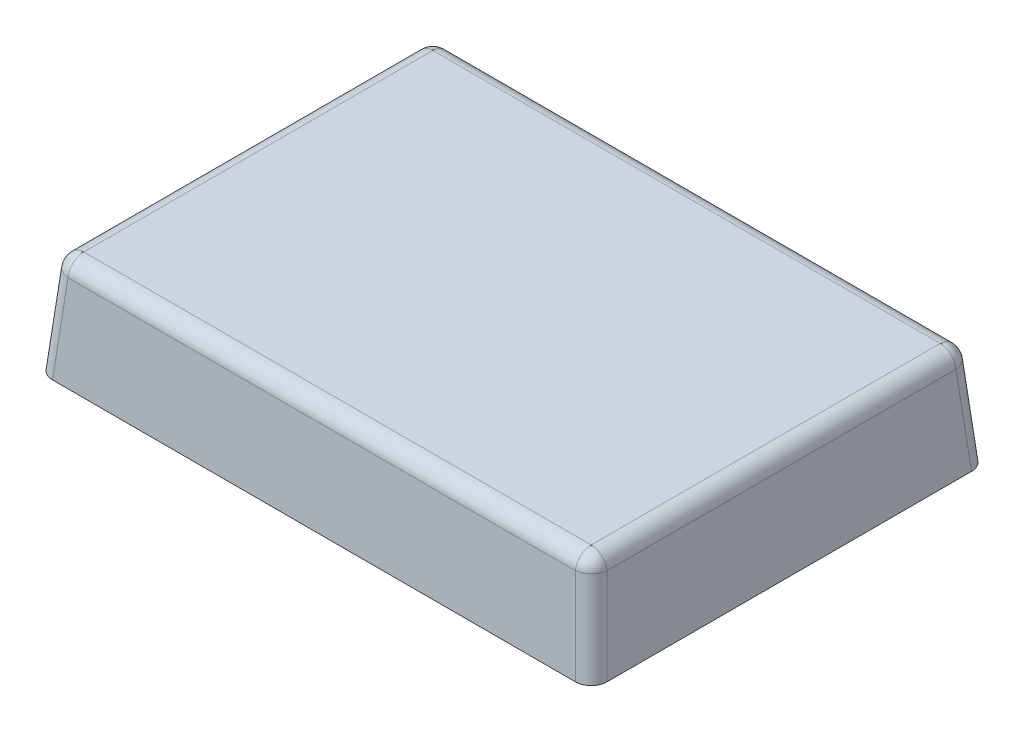
ISO-10303-21;
HEADER;
FILE_DESCRIPTION(('STEP AP214'),'2;1');
FILE_NAME('part.step','',(''),(''),'','','');
FILE_SCHEMA(('AUTOMOTIVE_DESIGN { 1 0 10303 214 1 1 1 1 }'));
ENDSEC;
DATA;
#1=APPLICATION_CONTEXT('core data for automotive mechanical design processes');
#2=APPLICATION_PROTOCOL_DEFINITION('international standard','automotive_design',2000,#1);
#3=PRODUCT_CONTEXT('',#1,'mechanical');
#4=PRODUCT('Part','Part','',(#3));
#5=PRODUCT_RELATED_PRODUCT_CATEGORY('part','',(#4));
#6=PRODUCT_DEFINITION_FORMATION('','',#4);
#7=PRODUCT_DEFINITION_CONTEXT('part definition',#1,'design');
#8=PRODUCT_DEFINITION('design','',#6,#7);
#9=PRODUCT_DEFINITION_SHAPE('','',#8);
#10=(LENGTH_UNIT() NAMED_UNIT(*) SI_UNIT(.MILLI.,.METRE.));
#11=(NAMED_UNIT(*) PLANE_ANGLE_UNIT() SI_UNIT($,.RADIAN.));
#12=(NAMED_UNIT(*) SI_UNIT($,.STERADIAN.) SOLID_ANGLE_UNIT());
#13=UNCERTAINTY_MEASURE_WITH_UNIT(LENGTH_MEASURE(1.E-05),#10,'distance_accuracy_value','');
#14=(GEOMETRIC_REPRESENTATION_CONTEXT(3) GLOBAL_UNCERTAINTY_ASSIGNED_CONTEXT((#13)) GLOBAL_UNIT_ASSIGNED_CONTEXT((#10,
#11,#12)) REPRESENTATION_CONTEXT('',''));
#15=CARTESIAN_POINT('',(0.,0.,0.));
#16=DIRECTION('',(0.,0.,1.));
#17=DIRECTION('',(1.,0.,0.));
#18=AXIS2_PLACEMENT_3D('',#15,#16,#17);
#19=CARTESIAN_POINT('',(0.,0.185,-0.220299850261));
#20=DIRECTION('',(-1.,0.,0.));
#21=DIRECTION('',(0.,0.,1.));
#22=AXIS2_PLACEMENT_3D('',#19,#20,#21);
#23=CYLINDRICAL_SURFACE('',#22,0.02);
#24=CARTESIAN_POINT('',(0.320299850261,0.185,-0.220299850261));
#25=DIRECTION('',(-1.,0.,0.));
#26=DIRECTION('',(0.,1.,0.));
#27=AXIS2_PLACEMENT_3D('',#24,#25,#26);
#28=CIRCLE('',#27,0.02);
#29=CARTESIAN_POINT('',(0.320299850261,0.205,-0.220299850261));
#30=VERTEX_POINT('',#29);
#31=CARTESIAN_POINT('',(0.320299850261,0.186743114855,-0.240223744223));
#32=VERTEX_POINT('',#31);
#33=EDGE_CURVE('E27',#30,#32,#28,.T.);
#34=ORIENTED_EDGE('',*,*,#33,.T.);
#35=DIRECTION('',(1.,0.,0.));
#36=VECTOR('',#35,1.);
#37=CARTESIAN_POINT('',(0.338626473742,0.186743114855,-0.240223744223));
#38=LINE('',#37,#36);
#39=CARTESIAN_POINT('',(-0.320299850261,0.186743114855,-0.240223744223));
#40=VERTEX_POINT('',#39);
#41=EDGE_CURVE('E106',#40,#32,#38,.T.);
#42=ORIENTED_EDGE('',*,*,#41,.F.);
#43=CARTESIAN_POINT('',(-0.320299850261,0.185,-0.220299850261));
#44=DIRECTION('',(1.,0.,0.));
#45=DIRECTION('',(0.,0.,1.));
#46=AXIS2_PLACEMENT_3D('',#43,#44,#45);
#47=CIRCLE('',#46,0.02);
#48=CARTESIAN_POINT('',(-0.320299850261,0.205,-0.220299850261));
#49=VERTEX_POINT('',#48);
#50=EDGE_CURVE('E11',#40,#49,#47,.T.);
#51=ORIENTED_EDGE('',*,*,#50,.T.);
#52=DIRECTION('',(-1.,0.,0.));
#53=VECTOR('',#52,1.);
#54=CARTESIAN_POINT('',(-0.338626473742,0.205,-0.220299850261));
#55=LINE('',#54,#53);
#56=EDGE_CURVE('E86',#30,#49,#55,.T.);
#57=ORIENTED_EDGE('',*,*,#56,.F.);
#58=EDGE_LOOP('',(#34,#42,#51,#57));
#59=FACE_BOUND('',#58,.T.);
#60=ADVANCED_FACE('F17',(#59),#23,.T.);
#61=CARTESIAN_POINT('',(-0.320299850261,0.185,-0.220299850261));
#62=DIRECTION('',(0.,1.,0.));
#63=DIRECTION('',(1.,0.,0.));
#64=AXIS2_PLACEMENT_3D('',#61,#62,#63);
#65=SPHERICAL_SURFACE('',#64,0.02);
#66=CARTESIAN_POINT('',(-0.320299850261,0.185,-0.220299850261));
#67=DIRECTION('',(0.086826593864247,0.992432509138967,0.0868265938642471));
#68=DIRECTION('',(-0.996194698091746,0.0871557427476575,0.));
#69=AXIS2_PLACEMENT_3D('',#66,#67,#68);
#70=CIRCLE('',#69,0.02);
#71=CARTESIAN_POINT('',(-0.340223744223,0.186743114855,-0.220299850261));
#72=VERTEX_POINT('',#71);
#73=EDGE_CURVE('E71',#40,#72,#70,.T.);
#74=ORIENTED_EDGE('',*,*,#73,.T.);
#75=CARTESIAN_POINT('',(-0.320299850261,0.185,-0.220299850261));
#76=DIRECTION('',(0.,0.,-1.));
#77=DIRECTION('',(0.,1.,0.));
#78=AXIS2_PLACEMENT_3D('',#75,#76,#77);
#79=CIRCLE('',#78,0.02);
#80=EDGE_CURVE('E83',#72,#49,#79,.T.);
#81=ORIENTED_EDGE('',*,*,#80,.T.);
#82=ORIENTED_EDGE('',*,*,#50,.F.);
#83=EDGE_LOOP('',(#74,#81,#82));
#84=FACE_BOUND('',#83,.T.);
#85=ADVANCED_FACE('F19',(#84),#65,.T.);
#86=CARTESIAN_POINT('',(0.320299850261,0.185,-0.220299850261));
#87=DIRECTION('',(0.,1.,0.));
#88=DIRECTION('',(1.,0.,0.));
#89=AXIS2_PLACEMENT_3D('',#86,#87,#88);
#90=SPHERICAL_SURFACE('',#89,0.02);
#91=CARTESIAN_POINT('',(0.320299850261,0.185,-0.220299850261));
#92=DIRECTION('',(0.,0.,-1.));
#93=DIRECTION('',(-1.,0.,0.));
#94=AXIS2_PLACEMENT_3D('',#91,#92,#93);
#95=CIRCLE('',#94,0.02);
#96=CARTESIAN_POINT('',(0.340223744223,0.186743114855,-0.220299850261));
#97=VERTEX_POINT('',#96);
#98=EDGE_CURVE('E63',#30,#97,#95,.T.);
#99=ORIENTED_EDGE('',*,*,#98,.T.);
#100=CARTESIAN_POINT('',(0.320299850261,0.185,-0.220299850261));
#101=DIRECTION('',(-0.0868265938642471,0.992432509138967,0.086826593864247));
#102=DIRECTION('',(0.,-0.0871557427476575,0.996194698091746));
#103=AXIS2_PLACEMENT_3D('',#100,#101,#102);
#104=CIRCLE('',#103,0.02);
#105=EDGE_CURVE('E65',#97,#32,#104,.T.);
#106=ORIENTED_EDGE('',*,*,#105,.T.);
#107=ORIENTED_EDGE('',*,*,#33,.F.);
#108=EDGE_LOOP('',(#99,#106,#107));
#109=FACE_BOUND('',#108,.T.);
#110=ADVANCED_FACE('F61',(#109),#90,.T.);
#111=CARTESIAN_POINT('',(-0.326456880733,0.114624819683,-0.226456880733));
#112=DIRECTION('',(-0.086826593864247,-0.992432509138967,-0.0868265938642471));
#113=DIRECTION('',(0.996194698091746,-0.0871557427476575,0.));
#114=AXIS2_PLACEMENT_3D('',#111,#112,#113);
#115=CYLINDRICAL_SURFACE('',#114,0.02);
#116=CARTESIAN_POINT('',(-0.329923603249521,0.075,-0.229923603249521));
#117=DIRECTION('',(0.,-1.,0.));
#118=DIRECTION('',(0.70710678118655,0.,0.707106781186545));
#119=AXIS2_PLACEMENT_3D('',#116,#117,#118);
#120=ELLIPSE('',#119,0.020152503889007,0.02);
#121=CARTESIAN_POINT('',(-0.35,0.075,-0.230076106038));
#122=VERTEX_POINT('',#121);
#123=CARTESIAN_POINT('',(-0.330076106038,0.075,-0.25));
#124=VERTEX_POINT('',#123);
#125=EDGE_CURVE('E112',#122,#124,#120,.T.);
#126=ORIENTED_EDGE('',*,*,#125,.F.);
#127=DIRECTION('',(-0.0868265938642471,-0.992432509138967,-0.0868265938642471));
#128=VECTOR('',#127,1.);
#129=CARTESIAN_POINT('',(-0.346380774694,0.116367934538,-0.226456880733));
#130=LINE('',#129,#128);
#131=EDGE_CURVE('E203',#72,#122,#130,.T.);
#132=ORIENTED_EDGE('',*,*,#131,.F.);
#133=ORIENTED_EDGE('',*,*,#73,.F.);
#134=DIRECTION('',(0.0868265938642471,0.992432509138967,0.0868265938642471));
#135=VECTOR('',#134,1.);
#136=CARTESIAN_POINT('',(-0.324949109252,0.13360184142,-0.244873003214));
#137=LINE('',#136,#135);
#138=EDGE_CURVE('E186',#124,#40,#137,.T.);
#139=ORIENTED_EDGE('',*,*,#138,.F.);
#140=EDGE_LOOP('',(#126,#132,#133,#139));
#141=FACE_BOUND('',#140,.T.);
#142=ADVANCED_FACE('F294',(#141),#115,.T.);
#143=CARTESIAN_POINT('',(-0.320299850261,0.185,0.));
#144=DIRECTION('',(0.,0.,1.));
#145=DIRECTION('',(1.,0.,0.));
#146=AXIS2_PLACEMENT_3D('',#143,#144,#145);
#147=CYLINDRICAL_SURFACE('',#146,0.02);
#148=CARTESIAN_POINT('',(-0.320299850261,0.185,0.220299850261));
#149=DIRECTION('',(0.,0.,-1.));
#150=DIRECTION('',(1.,0.,0.));
#151=AXIS2_PLACEMENT_3D('',#148,#149,#150);
#152=CIRCLE('',#151,0.02);
#153=CARTESIAN_POINT('',(-0.340223744223,0.186743114855,0.220299850261));
#154=VERTEX_POINT('',#153);
#155=CARTESIAN_POINT('',(-0.320299850261,0.205,0.220299850261));
#156=VERTEX_POINT('',#155);
#157=EDGE_CURVE('E39',#154,#156,#152,.T.);
#158=ORIENTED_EDGE('',*,*,#157,.T.);
#159=DIRECTION('',(0.,0.,1.));
#160=VECTOR('',#159,1.);
#161=CARTESIAN_POINT('',(-0.320299850261,0.205,0.238626473742));
#162=LINE('',#161,#160);
#163=EDGE_CURVE('E92',#49,#156,#162,.T.);
#164=ORIENTED_EDGE('',*,*,#163,.F.);
#165=ORIENTED_EDGE('',*,*,#80,.F.);
#166=DIRECTION('',(0.,0.,-1.));
#167=VECTOR('',#166,1.);
#168=CARTESIAN_POINT('',(-0.340223744223,0.186743114855,-0.238626473742));
#169=LINE('',#168,#167);
#170=EDGE_CURVE('E212',#154,#72,#169,.T.);
#171=ORIENTED_EDGE('',*,*,#170,.F.);
#172=EDGE_LOOP('',(#158,#164,#165,#171));
#173=FACE_BOUND('',#172,.T.);
#174=ADVANCED_FACE('F291',(#173),#147,.T.);
#175=CARTESIAN_POINT('',(0.320299850261,0.185,0.));
#176=DIRECTION('',(0.,0.,-1.));
#177=DIRECTION('',(-1.,0.,0.));
#178=AXIS2_PLACEMENT_3D('',#175,#176,#177);
#179=CYLINDRICAL_SURFACE('',#178,0.02);
#180=CARTESIAN_POINT('',(0.320299850261,0.185,0.220299850261));
#181=DIRECTION('',(0.,0.,-1.));
#182=DIRECTION('',(1.,0.,0.));
#183=AXIS2_PLACEMENT_3D('',#180,#181,#182);
#184=CIRCLE('',#183,0.02);
#185=CARTESIAN_POINT('',(0.320299850261,0.205,0.220299850261));
#186=VERTEX_POINT('',#185);
#187=CARTESIAN_POINT('',(0.340223744223,0.186743114855,0.220299850261));
#188=VERTEX_POINT('',#187);
#189=EDGE_CURVE('E144',#186,#188,#184,.T.);
#190=ORIENTED_EDGE('',*,*,#189,.T.);
#191=DIRECTION('',(0.,0.,1.));
#192=VECTOR('',#191,1.);
#193=CARTESIAN_POINT('',(0.340223744223,0.186743114855,0.238626473742));
#194=LINE('',#193,#192);
#195=EDGE_CURVE('E80',#97,#188,#194,.T.);
#196=ORIENTED_EDGE('',*,*,#195,.F.);
#197=ORIENTED_EDGE('',*,*,#98,.F.);
#198=DIRECTION('',(0.,0.,-1.));
#199=VECTOR('',#198,1.);
#200=CARTESIAN_POINT('',(0.320299850261,0.205,-0.238626473742));
#201=LINE('',#200,#199);
#202=EDGE_CURVE('E78',#186,#30,#201,.T.);
#203=ORIENTED_EDGE('',*,*,#202,.F.);
#204=EDGE_LOOP('',(#190,#196,#197,#203));
#205=FACE_BOUND('',#204,.T.);
#206=ADVANCED_FACE('F76',(#205),#179,.T.);
#207=CARTESIAN_POINT('',(0.330226309434,0.07154005247875,-0.230226309434));
#208=DIRECTION('',(0.0868265938642471,-0.992432509138967,-0.086826593864247));
#209=DIRECTION('',(0.,0.0871557427476575,-0.996194698091746));
#210=AXIS2_PLACEMENT_3D('',#207,#208,#209);
#211=CYLINDRICAL_SURFACE('',#210,0.02);
#212=CARTESIAN_POINT('',(0.329923603249496,0.075,-0.229923603249496));
#213=DIRECTION('',(0.,-1.,0.));
#214=DIRECTION('',(0.707106781186545,0.,-0.70710678118655));
#215=AXIS2_PLACEMENT_3D('',#212,#213,#214);
#216=ELLIPSE('',#215,0.020152503889007,0.02);
#217=CARTESIAN_POINT('',(0.330076106038,0.075,-0.25));
#218=VERTEX_POINT('',#217);
#219=CARTESIAN_POINT('',(0.35,0.075,-0.230076106038));
#220=VERTEX_POINT('',#219);
#221=EDGE_CURVE('E116',#218,#220,#216,.T.);
#222=ORIENTED_EDGE('',*,*,#221,.F.);
#223=DIRECTION('',(0.0868265938642471,-0.992432509138967,-0.0868265938642471));
#224=VECTOR('',#223,1.);
#225=CARTESIAN_POINT('',(0.330226309434,0.0732831673337,-0.250150203395));
#226=LINE('',#225,#224);
#227=EDGE_CURVE('E99',#32,#218,#226,.T.);
#228=ORIENTED_EDGE('',*,*,#227,.F.);
#229=ORIENTED_EDGE('',*,*,#105,.F.);
#230=DIRECTION('',(-0.0868265938642471,0.992432509138967,0.0868265938642471));
#231=VECTOR('',#230,1.);
#232=CARTESIAN_POINT('',(0.346380774694,0.116367934538,-0.226456880733));
#233=LINE('',#232,#231);
#234=EDGE_CURVE('E165',#220,#97,#233,.T.);
#235=ORIENTED_EDGE('',*,*,#234,.F.);
#236=EDGE_LOOP('',(#222,#228,#229,#235));
#237=FACE_BOUND('',#236,.T.);
#238=ADVANCED_FACE('F241',(#237),#211,.T.);
#239=CARTESIAN_POINT('',(-0.320299850261,0.185,0.220299850261));
#240=DIRECTION('',(0.,1.,0.));
#241=DIRECTION('',(1.,0.,0.));
#242=AXIS2_PLACEMENT_3D('',#239,#240,#241);
#243=SPHERICAL_SURFACE('',#242,0.02);
#244=CARTESIAN_POINT('',(-0.320299850261,0.185,0.220299850261));
#245=DIRECTION('',(0.0868265938642471,0.992432509138967,-0.086826593864247));
#246=DIRECTION('',(0.,0.0871557427476575,0.996194698091746));
#247=AXIS2_PLACEMENT_3D('',#244,#245,#246);
#248=CIRCLE('',#247,0.02);
#249=CARTESIAN_POINT('',(-0.320299850261,0.186743114855,0.240223744223));
#250=VERTEX_POINT('',#249);
#251=EDGE_CURVE('E140',#154,#250,#248,.T.);
#252=ORIENTED_EDGE('',*,*,#251,.T.);
#253=CARTESIAN_POINT('',(-0.320299850261,0.185,0.220299850261));
#254=DIRECTION('',(-1.,0.,0.));
#255=DIRECTION('',(0.,-1.,0.));
#256=AXIS2_PLACEMENT_3D('',#253,#254,#255);
#257=CIRCLE('',#256,0.02);
#258=EDGE_CURVE('E133',#250,#156,#257,.T.);
#259=ORIENTED_EDGE('',*,*,#258,.T.);
#260=ORIENTED_EDGE('',*,*,#157,.F.);
#261=EDGE_LOOP('',(#252,#259,#260));
#262=FACE_BOUND('',#261,.T.);
#263=ADVANCED_FACE('F282',(#262),#243,.T.);
#264=CARTESIAN_POINT('',(0.320299850261,0.185,0.220299850261));
#265=DIRECTION('',(0.,1.,0.));
#266=DIRECTION('',(1.,0.,0.));
#267=AXIS2_PLACEMENT_3D('',#264,#265,#266);
#268=SPHERICAL_SURFACE('',#267,0.02);
#269=CARTESIAN_POINT('',(0.320299850261,0.185,0.220299850261));
#270=DIRECTION('',(1.,0.,0.));
#271=DIRECTION('',(0.,0.,-1.));
#272=AXIS2_PLACEMENT_3D('',#269,#270,#271);
#273=CIRCLE('',#272,0.02);
#274=CARTESIAN_POINT('',(0.320299850261,0.186743114855,0.240223744223));
#275=VERTEX_POINT('',#274);
#276=EDGE_CURVE('E136',#186,#275,#273,.T.);
#277=ORIENTED_EDGE('',*,*,#276,.T.);
#278=CARTESIAN_POINT('',(0.320299850261,0.185,0.220299850261));
#279=DIRECTION('',(-0.0868265938642471,0.992432509138967,-0.086826593864247));
#280=DIRECTION('',(0.,0.0871557427476575,0.996194698091746));
#281=AXIS2_PLACEMENT_3D('',#278,#279,#280);
#282=CIRCLE('',#281,0.02);
#283=EDGE_CURVE('E129',#275,#188,#282,.T.);
#284=ORIENTED_EDGE('',*,*,#283,.T.);
#285=ORIENTED_EDGE('',*,*,#189,.F.);
#286=EDGE_LOOP('',(#277,#284,#285));
#287=FACE_BOUND('',#286,.T.);
#288=ADVANCED_FACE('F226',(#287),#268,.T.);
#289=CARTESIAN_POINT('',(-0.324949109252,0.131858726565,0.224949109252));
#290=DIRECTION('',(-0.0868265938642471,-0.992432509138967,0.086826593864247));
#291=DIRECTION('',(0.,-0.0871557427476575,-0.996194698091746));
#292=AXIS2_PLACEMENT_3D('',#289,#290,#291);
#293=CYLINDRICAL_SURFACE('',#292,0.02);
#294=CARTESIAN_POINT('',(-0.329923603248958,0.075,0.229923603248958));
#295=DIRECTION('',(0.,-1.,0.));
#296=DIRECTION('',(0.707106781186545,0.,-0.70710678118655));
#297=AXIS2_PLACEMENT_3D('',#294,#295,#296);
#298=ELLIPSE('',#297,0.020152503889007,0.02);
#299=CARTESIAN_POINT('',(-0.330076106038,0.075,0.25));
#300=VERTEX_POINT('',#299);
#301=CARTESIAN_POINT('',(-0.35,0.075,0.230076106038));
#302=VERTEX_POINT('',#301);
#303=EDGE_CURVE('E125',#300,#302,#298,.T.);
#304=ORIENTED_EDGE('',*,*,#303,.F.);
#305=DIRECTION('',(-0.0868265938642471,-0.992432509138967,0.0868265938642471));
#306=VECTOR('',#305,1.);
#307=CARTESIAN_POINT('',(-0.324949109252,0.13360184142,0.244873003214));
#308=LINE('',#307,#306);
#309=EDGE_CURVE('E177',#250,#300,#308,.T.);
#310=ORIENTED_EDGE('',*,*,#309,.F.);
#311=ORIENTED_EDGE('',*,*,#251,.F.);
#312=DIRECTION('',(0.0868265938642471,0.992432509138967,-0.0868265938642471));
#313=VECTOR('',#312,1.);
#314=CARTESIAN_POINT('',(-0.350150203395,0.0732831673337,0.230226309434));
#315=LINE('',#314,#313);
#316=EDGE_CURVE('E178',#302,#154,#315,.T.);
#317=ORIENTED_EDGE('',*,*,#316,.F.);
#318=EDGE_LOOP('',(#304,#310,#311,#317));
#319=FACE_BOUND('',#318,.T.);
#320=ADVANCED_FACE('F287',(#319),#293,.T.);
#321=CARTESIAN_POINT('',(0.,0.185,0.220299850261));
#322=DIRECTION('',(1.,0.,0.));
#323=DIRECTION('',(0.,0.,-1.));
#324=AXIS2_PLACEMENT_3D('',#321,#322,#323);
#325=CYLINDRICAL_SURFACE('',#324,0.02);
#326=ORIENTED_EDGE('',*,*,#258,.F.);
#327=DIRECTION('',(-1.,0.,0.));
#328=VECTOR('',#327,1.);
#329=CARTESIAN_POINT('',(-0.338626473742,0.186743114855,0.240223744223));
#330=LINE('',#329,#328);
#331=EDGE_CURVE('E174',#275,#250,#330,.T.);
#332=ORIENTED_EDGE('',*,*,#331,.F.);
#333=ORIENTED_EDGE('',*,*,#276,.F.);
#334=DIRECTION('',(1.,0.,0.));
#335=VECTOR('',#334,1.);
#336=CARTESIAN_POINT('',(0.338626473742,0.205,0.220299850261));
#337=LINE('',#336,#335);
#338=EDGE_CURVE('E97',#156,#186,#337,.T.);
#339=ORIENTED_EDGE('',*,*,#338,.F.);
#340=EDGE_LOOP('',(#326,#332,#333,#339));
#341=FACE_BOUND('',#340,.T.);
#342=ADVANCED_FACE('F303',(#341),#325,.T.);
#343=CARTESIAN_POINT('',(0.330226309434,0.07154005247875,0.230226309434));
#344=DIRECTION('',(0.086826593864247,-0.992432509138967,0.0868265938642471));
#345=DIRECTION('',(0.996194698091746,0.0871557427476575,0.));
#346=AXIS2_PLACEMENT_3D('',#343,#344,#345);
#347=CYLINDRICAL_SURFACE('',#346,0.02);
#348=CARTESIAN_POINT('',(0.329923603249496,0.075,0.229923603249496));
#349=DIRECTION('',(0.,-1.,0.));
#350=DIRECTION('',(0.70710678118655,0.,0.707106781186545));
#351=AXIS2_PLACEMENT_3D('',#348,#349,#350);
#352=ELLIPSE('',#351,0.020152503889007,0.02);
#353=CARTESIAN_POINT('',(0.35,0.075,0.230076106038));
#354=VERTEX_POINT('',#353);
#355=CARTESIAN_POINT('',(0.330076106038,0.075,0.25));
#356=VERTEX_POINT('',#355);
#357=EDGE_CURVE('E124',#354,#356,#352,.T.);
#358=ORIENTED_EDGE('',*,*,#357,.F.);
#359=DIRECTION('',(0.0868265938642471,-0.992432509138967,0.0868265938642471));
#360=VECTOR('',#359,1.);
#361=CARTESIAN_POINT('',(0.350150203395,0.0732831673337,0.230226309434));
#362=LINE('',#361,#360);
#363=EDGE_CURVE('E173',#188,#354,#362,.T.);
#364=ORIENTED_EDGE('',*,*,#363,.F.);
#365=ORIENTED_EDGE('',*,*,#283,.F.);
#366=DIRECTION('',(-0.0868265938642471,0.992432509138967,-0.0868265938642471));
#367=VECTOR('',#366,1.);
#368=CARTESIAN_POINT('',(0.330226309434,0.0732831673337,0.250150203395));
#369=LINE('',#368,#367);
#370=EDGE_CURVE('E166',#356,#275,#369,.T.);
#371=ORIENTED_EDGE('',*,*,#370,.F.);
#372=EDGE_LOOP('',(#358,#364,#365,#371));
#373=FACE_BOUND('',#372,.T.);
#374=ADVANCED_FACE('F231',(#373),#347,.T.);
#375=CARTESIAN_POINT('',(0.,0.075,0.));
#376=DIRECTION('',(0.,1.,0.));
#377=DIRECTION('',(1.,0.,0.));
#378=AXIS2_PLACEMENT_3D('',#375,#376,#377);
#379=PLANE('',#378);
#380=DIRECTION('',(0.,0.,1.));
#381=VECTOR('',#380,1.);
#382=CARTESIAN_POINT('',(-0.35,0.075,0.25));
#383=LINE('',#382,#381);
#384=EDGE_CURVE('E196',#122,#302,#383,.T.);
#385=ORIENTED_EDGE('',*,*,#384,.F.);
#386=ORIENTED_EDGE('',*,*,#125,.T.);
#387=DIRECTION('',(-1.,0.,0.));
#388=VECTOR('',#387,1.);
#389=CARTESIAN_POINT('',(0.35,0.075,-0.25));
#390=LINE('',#389,#388);
#391=EDGE_CURVE('E109',#218,#124,#390,.T.);
#392=ORIENTED_EDGE('',*,*,#391,.F.);
#393=ORIENTED_EDGE('',*,*,#221,.T.);
#394=DIRECTION('',(0.,0.,-1.));
#395=VECTOR('',#394,1.);
#396=CARTESIAN_POINT('',(0.35,0.075,0.25));
#397=LINE('',#396,#395);
#398=EDGE_CURVE('E161',#354,#220,#397,.T.);
#399=ORIENTED_EDGE('',*,*,#398,.F.);
#400=ORIENTED_EDGE('',*,*,#357,.T.);
#401=DIRECTION('',(1.,0.,0.));
#402=VECTOR('',#401,1.);
#403=CARTESIAN_POINT('',(0.35,0.075,0.25));
#404=LINE('',#403,#402);
#405=EDGE_CURVE('E170',#300,#356,#404,.T.);
#406=ORIENTED_EDGE('',*,*,#405,.F.);
#407=ORIENTED_EDGE('',*,*,#303,.T.);
#408=EDGE_LOOP('',(#385,#386,#392,#393,#399,#400,#406,#407));
#409=FACE_BOUND('',#408,.T.);
#410=ADVANCED_FACE('F297',(#409),#379,.F.);
#411=CARTESIAN_POINT('',(0.,0.205,0.));
#412=DIRECTION('',(0.,1.,0.));
#413=DIRECTION('',(1.,0.,0.));
#414=AXIS2_PLACEMENT_3D('',#411,#412,#413);
#415=PLANE('',#414);
#416=ORIENTED_EDGE('',*,*,#202,.T.);
#417=ORIENTED_EDGE('',*,*,#56,.T.);
#418=ORIENTED_EDGE('',*,*,#163,.T.);
#419=ORIENTED_EDGE('',*,*,#338,.T.);
#420=EDGE_LOOP('',(#416,#417,#418,#419));
#421=FACE_BOUND('',#420,.T.);
#422=ADVANCED_FACE('F95',(#421),#415,.T.);
#423=CARTESIAN_POINT('',(0.35,0.075,-0.25));
#424=DIRECTION('',(0.,0.0871557427476379,-0.996194698091747));
#425=DIRECTION('',(-1.,0.,0.));
#426=AXIS2_PLACEMENT_3D('',#423,#424,#425);
#427=PLANE('',#426);
#428=ORIENTED_EDGE('',*,*,#391,.T.);
#429=ORIENTED_EDGE('',*,*,#138,.T.);
#430=ORIENTED_EDGE('',*,*,#41,.T.);
#431=ORIENTED_EDGE('',*,*,#227,.T.);
#432=EDGE_LOOP('',(#428,#429,#430,#431));
#433=FACE_BOUND('',#432,.T.);
#434=ADVANCED_FACE('F438',(#433),#427,.T.);
#435=CARTESIAN_POINT('',(0.35,0.075,0.25));
#436=DIRECTION('',(0.996194698091747,0.0871557427476379,0.));
#437=DIRECTION('',(0.,0.,-1.));
#438=AXIS2_PLACEMENT_3D('',#435,#436,#437);
#439=PLANE('',#438);
#440=ORIENTED_EDGE('',*,*,#398,.T.);
#441=ORIENTED_EDGE('',*,*,#234,.T.);
#442=ORIENTED_EDGE('',*,*,#195,.T.);
#443=ORIENTED_EDGE('',*,*,#363,.T.);
#444=EDGE_LOOP('',(#440,#441,#442,#443));
#445=FACE_BOUND('',#444,.T.);
#446=ADVANCED_FACE('F235',(#445),#439,.T.);
#447=CARTESIAN_POINT('',(0.35,0.075,0.25));
#448=DIRECTION('',(0.,0.0871557427476379,0.996194698091747));
#449=DIRECTION('',(1.,0.,0.));
#450=AXIS2_PLACEMENT_3D('',#447,#448,#449);
#451=PLANE('',#450);
#452=ORIENTED_EDGE('',*,*,#331,.T.);
#453=ORIENTED_EDGE('',*,*,#309,.T.);
#454=ORIENTED_EDGE('',*,*,#405,.T.);
#455=ORIENTED_EDGE('',*,*,#370,.T.);
#456=EDGE_LOOP('',(#452,#453,#454,#455));
#457=FACE_BOUND('',#456,.T.);
#458=ADVANCED_FACE('F300',(#457),#451,.T.);
#459=CARTESIAN_POINT('',(-0.35,0.075,0.25));
#460=DIRECTION('',(-0.996194698091747,0.0871557427476379,0.));
#461=DIRECTION('',(0.,0.,1.));
#462=AXIS2_PLACEMENT_3D('',#459,#460,#461);
#463=PLANE('',#462);
#464=ORIENTED_EDGE('',*,*,#170,.T.);
#465=ORIENTED_EDGE('',*,*,#131,.T.);
#466=ORIENTED_EDGE('',*,*,#384,.T.);
#467=ORIENTED_EDGE('',*,*,#316,.T.);
#468=EDGE_LOOP('',(#464,#465,#466,#467));
#469=FACE_BOUND('',#468,.T.);
#470=ADVANCED_FACE('F289',(#469),#463,.T.);
#471=CLOSED_SHELL('',(#60,#85,#110,#142,#174,#206,#238,#263,#288,#320,#342,#374,#410,#422,#434,
#446,#458,#470));
#472=MANIFOLD_SOLID_BREP('B1',#471);
#473=ADVANCED_BREP_SHAPE_REPRESENTATION('',(#18,#472),#14);
#474=SHAPE_DEFINITION_REPRESENTATION(#9,#473);
ENDSEC;
END-ISO-10303-21;
